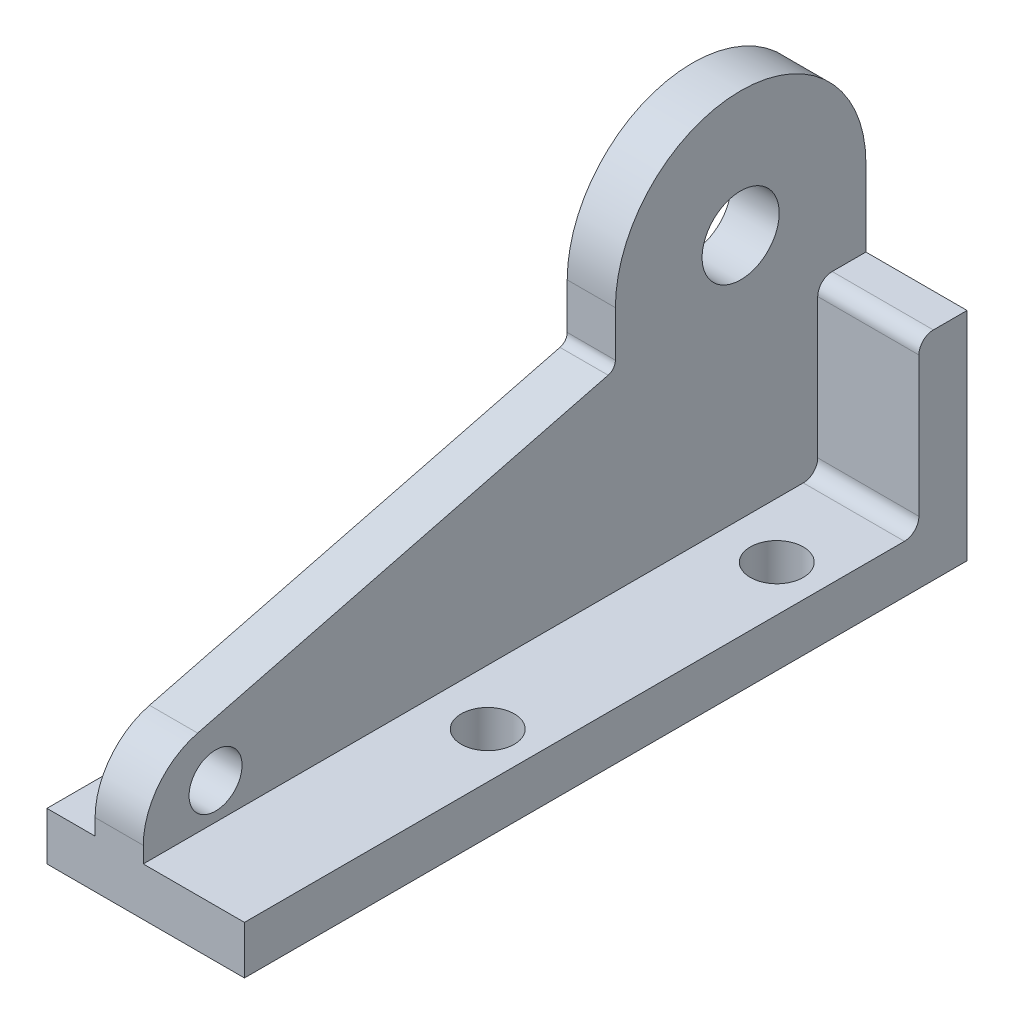
ISO-10303-21;
HEADER;
FILE_DESCRIPTION(('STEP AP214'),'2;1');
FILE_NAME('part.step','',(''),(''),'','','');
FILE_SCHEMA(('AUTOMOTIVE_DESIGN { 1 0 10303 214 1 1 1 1 }'));
ENDSEC;
DATA;
#1=APPLICATION_CONTEXT('core data for automotive mechanical design processes');
#2=APPLICATION_PROTOCOL_DEFINITION('international standard','automotive_design',2000,#1);
#3=PRODUCT_CONTEXT('',#1,'mechanical');
#4=PRODUCT('Part','Part','',(#3));
#5=PRODUCT_RELATED_PRODUCT_CATEGORY('part','',(#4));
#6=PRODUCT_DEFINITION_FORMATION('','',#4);
#7=PRODUCT_DEFINITION_CONTEXT('part definition',#1,'design');
#8=PRODUCT_DEFINITION('design','',#6,#7);
#9=PRODUCT_DEFINITION_SHAPE('','',#8);
#10=(LENGTH_UNIT() NAMED_UNIT(*) SI_UNIT(.MILLI.,.METRE.));
#11=(NAMED_UNIT(*) PLANE_ANGLE_UNIT() SI_UNIT($,.RADIAN.));
#12=(NAMED_UNIT(*) SI_UNIT($,.STERADIAN.) SOLID_ANGLE_UNIT());
#13=UNCERTAINTY_MEASURE_WITH_UNIT(LENGTH_MEASURE(1.E-05),#10,'distance_accuracy_value','');
#14=(GEOMETRIC_REPRESENTATION_CONTEXT(3) GLOBAL_UNCERTAINTY_ASSIGNED_CONTEXT((#13)) GLOBAL_UNIT_ASSIGNED_CONTEXT((#10,
#11,#12)) REPRESENTATION_CONTEXT('',''));
#15=CARTESIAN_POINT('',(0.,0.,0.));
#16=DIRECTION('',(0.,0.,1.));
#17=DIRECTION('',(1.,0.,0.));
#18=AXIS2_PLACEMENT_3D('',#15,#16,#17);
#19=CARTESIAN_POINT('',(0.,0.,0.));
#20=DIRECTION('',(1.,0.,0.));
#21=DIRECTION('',(0.,0.,-1.));
#22=AXIS2_PLACEMENT_3D('',#19,#20,#21);
#23=PLANE('',#22);
#24=DIRECTION('',(0.,0.,1.));
#25=VECTOR('',#24,1.);
#26=CARTESIAN_POINT('',(0.,0.,0.));
#27=LINE('',#26,#25);
#28=CARTESIAN_POINT('',(0.,0.,-75.));
#29=VERTEX_POINT('',#28);
#30=CARTESIAN_POINT('',(0.,0.,75.));
#31=VERTEX_POINT('',#30);
#32=EDGE_CURVE('E43',#29,#31,#27,.T.);
#33=ORIENTED_EDGE('',*,*,#32,.T.);
#34=DIRECTION('',(0.,-1.,0.));
#35=VECTOR('',#34,1.);
#36=CARTESIAN_POINT('',(0.,10.,75.));
#37=LINE('',#36,#35);
#38=CARTESIAN_POINT('',(0.,10.,75.));
#39=VERTEX_POINT('',#38);
#40=EDGE_CURVE('E297',#39,#31,#37,.T.);
#41=ORIENTED_EDGE('',*,*,#40,.F.);
#42=DIRECTION('',(0.,0.,1.));
#43=VECTOR('',#42,1.);
#44=CARTESIAN_POINT('',(0.,10.,0.));
#45=LINE('',#44,#43);
#46=CARTESIAN_POINT('',(0.,10.,-62.));
#47=VERTEX_POINT('',#46);
#48=EDGE_CURVE('E300',#47,#39,#45,.T.);
#49=ORIENTED_EDGE('',*,*,#48,.F.);
#50=CARTESIAN_POINT('',(0.,13.,-62.));
#51=DIRECTION('',(1.,0.,0.));
#52=DIRECTION('',(0.,0.,-1.));
#53=AXIS2_PLACEMENT_3D('',#50,#51,#52);
#54=CIRCLE('',#53,3.);
#55=CARTESIAN_POINT('',(0.,13.,-65.));
#56=VERTEX_POINT('',#55);
#57=EDGE_CURVE('E295',#56,#47,#54,.F.);
#58=ORIENTED_EDGE('',*,*,#57,.F.);
#59=DIRECTION('',(0.,1.,0.));
#60=VECTOR('',#59,1.);
#61=CARTESIAN_POINT('',(0.,0.,-65.));
#62=LINE('',#61,#60);
#63=CARTESIAN_POINT('',(0.,42.,-65.));
#64=VERTEX_POINT('',#63);
#65=EDGE_CURVE('E298',#56,#64,#62,.T.);
#66=ORIENTED_EDGE('',*,*,#65,.T.);
#67=CARTESIAN_POINT('',(0.,42.,-68.));
#68=DIRECTION('',(1.,0.,0.));
#69=DIRECTION('',(0.,0.,-1.));
#70=AXIS2_PLACEMENT_3D('',#67,#68,#69);
#71=CIRCLE('',#70,3.);
#72=CARTESIAN_POINT('',(0.,45.,-68.));
#73=VERTEX_POINT('',#72);
#74=EDGE_CURVE('E11',#64,#73,#71,.F.);
#75=ORIENTED_EDGE('',*,*,#74,.T.);
#76=DIRECTION('',(0.,0.,-1.));
#77=VECTOR('',#76,1.);
#78=CARTESIAN_POINT('',(0.,45.,-75.));
#79=LINE('',#78,#77);
#80=CARTESIAN_POINT('',(0.,45.,-75.));
#81=VERTEX_POINT('',#80);
#82=EDGE_CURVE('E48',#73,#81,#79,.T.);
#83=ORIENTED_EDGE('',*,*,#82,.T.);
#84=DIRECTION('',(0.,1.,0.));
#85=VECTOR('',#84,1.);
#86=CARTESIAN_POINT('',(0.,10.,-75.));
#87=LINE('',#86,#85);
#88=EDGE_CURVE('E301',#29,#81,#87,.T.);
#89=ORIENTED_EDGE('',*,*,#88,.F.);
#90=EDGE_LOOP('',(#33,#41,#49,#58,#66,#75,#83,#89));
#91=FACE_BOUND('',#90,.T.);
#92=ADVANCED_FACE('F40',(#91),#23,.F.);
#93=CARTESIAN_POINT('',(0.,13.,-62.));
#94=DIRECTION('',(-1.,0.,0.));
#95=DIRECTION('',(0.,0.,1.));
#96=AXIS2_PLACEMENT_3D('',#93,#94,#95);
#97=CYLINDRICAL_SURFACE('',#96,3.);
#98=CARTESIAN_POINT('',(41.,13.,-62.));
#99=DIRECTION('',(-1.,0.,0.));
#100=DIRECTION('',(0.,0.,1.));
#101=AXIS2_PLACEMENT_3D('',#98,#99,#100);
#102=CIRCLE('',#101,3.);
#103=CARTESIAN_POINT('',(41.,13.,-65.));
#104=VERTEX_POINT('',#103);
#105=CARTESIAN_POINT('',(41.,10.,-62.));
#106=VERTEX_POINT('',#105);
#107=EDGE_CURVE('E284',#104,#106,#102,.T.);
#108=ORIENTED_EDGE('',*,*,#107,.F.);
#109=DIRECTION('',(-1.,0.,0.));
#110=VECTOR('',#109,1.);
#111=CARTESIAN_POINT('',(-41.,13.,-65.));
#112=LINE('',#111,#110);
#113=CARTESIAN_POINT('',(20.,13.,-65.));
#114=VERTEX_POINT('',#113);
#115=EDGE_CURVE('E282',#114,#104,#112,.F.);
#116=ORIENTED_EDGE('',*,*,#115,.F.);
#117=CARTESIAN_POINT('',(20.,13.,-62.));
#118=DIRECTION('',(1.,0.,0.));
#119=DIRECTION('',(0.,0.,-1.));
#120=AXIS2_PLACEMENT_3D('',#117,#118,#119);
#121=CIRCLE('',#120,3.);
#122=CARTESIAN_POINT('',(20.,10.,-62.));
#123=VERTEX_POINT('',#122);
#124=EDGE_CURVE('E280',#123,#114,#121,.T.);
#125=ORIENTED_EDGE('',*,*,#124,.F.);
#126=DIRECTION('',(-1.,0.,0.));
#127=VECTOR('',#126,1.);
#128=CARTESIAN_POINT('',(0.,10.,-62.));
#129=LINE('',#128,#127);
#130=EDGE_CURVE('E185',#106,#123,#129,.T.);
#131=ORIENTED_EDGE('',*,*,#130,.F.);
#132=EDGE_LOOP('',(#108,#116,#125,#131));
#133=FACE_BOUND('',#132,.T.);
#134=ADVANCED_FACE('F382',(#133),#97,.F.);
#135=CARTESIAN_POINT('',(-41.,0.,-65.));
#136=DIRECTION('',(0.,0.,1.));
#137=DIRECTION('',(1.,0.,0.));
#138=AXIS2_PLACEMENT_3D('',#135,#136,#137);
#139=PLANE('',#138);
#140=DIRECTION('',(0.,1.,0.));
#141=VECTOR('',#140,1.);
#142=CARTESIAN_POINT('',(20.,0.,-65.));
#143=LINE('',#142,#141);
#144=CARTESIAN_POINT('',(20.,42.,-65.));
#145=VERTEX_POINT('',#144);
#146=EDGE_CURVE('E322',#114,#145,#143,.T.);
#147=ORIENTED_EDGE('',*,*,#146,.F.);
#148=ORIENTED_EDGE('',*,*,#115,.T.);
#149=DIRECTION('',(0.,-1.,0.));
#150=VECTOR('',#149,1.);
#151=CARTESIAN_POINT('',(41.,0.,-65.));
#152=LINE('',#151,#150);
#153=CARTESIAN_POINT('',(41.,42.,-65.));
#154=VERTEX_POINT('',#153);
#155=EDGE_CURVE('E315',#154,#104,#152,.T.);
#156=ORIENTED_EDGE('',*,*,#155,.F.);
#157=DIRECTION('',(1.,0.,0.));
#158=VECTOR('',#157,1.);
#159=CARTESIAN_POINT('',(-41.,42.,-65.));
#160=LINE('',#159,#158);
#161=EDGE_CURVE('E260',#154,#145,#160,.F.);
#162=ORIENTED_EDGE('',*,*,#161,.T.);
#163=EDGE_LOOP('',(#147,#148,#156,#162));
#164=FACE_BOUND('',#163,.T.);
#165=ADVANCED_FACE('F389',(#164),#139,.T.);
#166=CARTESIAN_POINT('',(-41.,42.,-68.));
#167=DIRECTION('',(1.,0.,0.));
#168=DIRECTION('',(0.,0.,-1.));
#169=AXIS2_PLACEMENT_3D('',#166,#167,#168);
#170=CYLINDRICAL_SURFACE('',#169,3.);
#171=CARTESIAN_POINT('',(20.,42.,-68.));
#172=DIRECTION('',(1.,0.,0.));
#173=DIRECTION('',(0.,0.,-1.));
#174=AXIS2_PLACEMENT_3D('',#171,#172,#173);
#175=CIRCLE('',#174,3.);
#176=CARTESIAN_POINT('',(20.,45.,-68.));
#177=VERTEX_POINT('',#176);
#178=EDGE_CURVE('E263',#145,#177,#175,.F.);
#179=ORIENTED_EDGE('',*,*,#178,.F.);
#180=ORIENTED_EDGE('',*,*,#161,.F.);
#181=CARTESIAN_POINT('',(41.,42.,-68.));
#182=DIRECTION('',(-1.,0.,0.));
#183=DIRECTION('',(0.,0.,1.));
#184=AXIS2_PLACEMENT_3D('',#181,#182,#183);
#185=CIRCLE('',#184,3.);
#186=CARTESIAN_POINT('',(41.,45.,-68.));
#187=VERTEX_POINT('',#186);
#188=EDGE_CURVE('E258',#187,#154,#185,.F.);
#189=ORIENTED_EDGE('',*,*,#188,.F.);
#190=DIRECTION('',(1.,0.,0.));
#191=VECTOR('',#190,1.);
#192=CARTESIAN_POINT('',(-41.,45.,-68.));
#193=LINE('',#192,#191);
#194=EDGE_CURVE('E248',#177,#187,#193,.T.);
#195=ORIENTED_EDGE('',*,*,#194,.F.);
#196=EDGE_LOOP('',(#179,#180,#189,#195));
#197=FACE_BOUND('',#196,.T.);
#198=ADVANCED_FACE('F423',(#197),#170,.T.);
#199=CARTESIAN_POINT('',(0.,0.,-23.));
#200=DIRECTION('',(0.,0.,-1.));
#201=DIRECTION('',(-1.,0.,0.));
#202=AXIS2_PLACEMENT_3D('',#199,#200,#201);
#203=PLANE('',#202);
#204=DIRECTION('',(0.,-1.,0.));
#205=VECTOR('',#204,1.);
#206=CARTESIAN_POINT('',(10.,45.,-23.));
#207=LINE('',#206,#205);
#208=CARTESIAN_POINT('',(10.,61.,-23.));
#209=VERTEX_POINT('',#208);
#210=CARTESIAN_POINT('',(10.,51.5538473239565,-23.));
#211=VERTEX_POINT('',#210);
#212=EDGE_CURVE('E335',#209,#211,#207,.T.);
#213=ORIENTED_EDGE('',*,*,#212,.T.);
#214=DIRECTION('',(1.,0.,0.));
#215=VECTOR('',#214,1.);
#216=CARTESIAN_POINT('',(0.,51.5538473239565,-23.));
#217=LINE('',#216,#215);
#218=CARTESIAN_POINT('',(20.,51.5538473239565,-23.));
#219=VERTEX_POINT('',#218);
#220=EDGE_CURVE('E286',#211,#219,#217,.T.);
#221=ORIENTED_EDGE('',*,*,#220,.T.);
#222=DIRECTION('',(0.,1.,0.));
#223=VECTOR('',#222,1.);
#224=CARTESIAN_POINT('',(20.,45.,-23.));
#225=LINE('',#224,#223);
#226=CARTESIAN_POINT('',(20.,61.,-23.));
#227=VERTEX_POINT('',#226);
#228=EDGE_CURVE('E333',#219,#227,#225,.T.);
#229=ORIENTED_EDGE('',*,*,#228,.T.);
#230=DIRECTION('',(1.,0.,0.));
#231=VECTOR('',#230,1.);
#232=CARTESIAN_POINT('',(20.,61.,-23.));
#233=LINE('',#232,#231);
#234=EDGE_CURVE('E228',#227,#209,#233,.F.);
#235=ORIENTED_EDGE('',*,*,#234,.T.);
#236=EDGE_LOOP('',(#213,#221,#229,#235));
#237=FACE_BOUND('',#236,.T.);
#238=ADVANCED_FACE('F425',(#237),#203,.F.);
#239=CARTESIAN_POINT('',(0.,51.5538473239565,-21.));
#240=DIRECTION('',(1.,0.,0.));
#241=DIRECTION('',(0.,0.,-1.));
#242=AXIS2_PLACEMENT_3D('',#239,#240,#241);
#243=CYLINDRICAL_SURFACE('',#242,2.);
#244=CARTESIAN_POINT('',(10.,51.5538473239565,-21.));
#245=DIRECTION('',(-1.,0.,0.));
#246=DIRECTION('',(0.,-1.,0.));
#247=AXIS2_PLACEMENT_3D('',#244,#245,#246);
#248=CIRCLE('',#247,2.);
#249=CARTESIAN_POINT('',(10.,49.6159110937015,-21.4943714873099));
#250=VERTEX_POINT('',#249);
#251=EDGE_CURVE('E293',#250,#211,#248,.F.);
#252=ORIENTED_EDGE('',*,*,#251,.F.);
#253=DIRECTION('',(1.,0.,0.));
#254=VECTOR('',#253,1.);
#255=CARTESIAN_POINT('',(-95.8489489791939,49.6159110937015,-21.4943714873099));
#256=LINE('',#255,#254);
#257=CARTESIAN_POINT('',(20.,49.6159110937015,-21.4943714873099));
#258=VERTEX_POINT('',#257);
#259=EDGE_CURVE('E289',#258,#250,#256,.F.);
#260=ORIENTED_EDGE('',*,*,#259,.F.);
#261=CARTESIAN_POINT('',(20.,51.5538473239565,-21.));
#262=DIRECTION('',(1.,0.,0.));
#263=DIRECTION('',(0.,0.,-1.));
#264=AXIS2_PLACEMENT_3D('',#261,#262,#263);
#265=CIRCLE('',#264,2.);
#266=EDGE_CURVE('E291',#219,#258,#265,.F.);
#267=ORIENTED_EDGE('',*,*,#266,.F.);
#268=ORIENTED_EDGE('',*,*,#220,.F.);
#269=EDGE_LOOP('',(#252,#260,#267,#268));
#270=FACE_BOUND('',#269,.T.);
#271=ADVANCED_FACE('F431',(#270),#243,.F.);
#272=CARTESIAN_POINT('',(-95.8489489791939,50.,-23.));
#273=DIRECTION('',(0.,0.968968115127499,0.247185743654974));
#274=DIRECTION('',(0.,-0.247185743654974,0.968968115127499));
#275=AXIS2_PLACEMENT_3D('',#272,#273,#274);
#276=PLANE('',#275);
#277=DIRECTION('',(0.,-0.247185743654974,0.968968115127499));
#278=VECTOR('',#277,1.);
#279=CARTESIAN_POINT('',(20.,50.,-23.));
#280=LINE('',#279,#278);
#281=CARTESIAN_POINT('',(20.,27.8806667972386,63.7077861548246));
#282=VERTEX_POINT('',#281);
#283=EDGE_CURVE('E198',#258,#282,#280,.T.);
#284=ORIENTED_EDGE('',*,*,#283,.F.);
#285=ORIENTED_EDGE('',*,*,#259,.T.);
#286=DIRECTION('',(0.,-0.247185743654974,0.968968115127499));
#287=VECTOR('',#286,1.);
#288=CARTESIAN_POINT('',(10.,50.,-23.));
#289=LINE('',#288,#287);
#290=CARTESIAN_POINT('',(10.,27.8806667972386,63.7077861548246));
#291=VERTEX_POINT('',#290);
#292=EDGE_CURVE('E197',#250,#291,#289,.T.);
#293=ORIENTED_EDGE('',*,*,#292,.T.);
#294=DIRECTION('',(1.,0.,0.));
#295=VECTOR('',#294,1.);
#296=CARTESIAN_POINT('',(20.,27.8806667972386,63.7077861548246));
#297=LINE('',#296,#295);
#298=EDGE_CURVE('E239',#291,#282,#297,.T.);
#299=ORIENTED_EDGE('',*,*,#298,.T.);
#300=EDGE_LOOP('',(#284,#285,#293,#299));
#301=FACE_BOUND('',#300,.T.);
#302=ADVANCED_FACE('F433',(#301),#276,.T.);
#303=CARTESIAN_POINT('',(-41.,17.5,60.));
#304=DIRECTION('',(1.,0.,0.));
#305=DIRECTION('',(0.,0.,-1.));
#306=AXIS2_PLACEMENT_3D('',#303,#304,#305);
#307=CYLINDRICAL_SURFACE('',#306,5.5);
#308=CARTESIAN_POINT('',(10.,17.5,60.));
#309=DIRECTION('',(-1.,0.,0.));
#310=DIRECTION('',(0.,-1.,0.));
#311=AXIS2_PLACEMENT_3D('',#308,#309,#310);
#312=CIRCLE('',#311,5.5);
#313=CARTESIAN_POINT('',(10.,12.,60.));
#314=VERTEX_POINT('',#313);
#315=EDGE_CURVE('E249',#314,#314,#312,.T.);
#316=ORIENTED_EDGE('',*,*,#315,.T.);
#317=EDGE_LOOP('',(#316));
#318=FACE_BOUND('',#317,.T.);
#319=CARTESIAN_POINT('',(20.,17.5,60.));
#320=DIRECTION('',(1.,0.,0.));
#321=DIRECTION('',(0.,0.,-1.));
#322=AXIS2_PLACEMENT_3D('',#319,#320,#321);
#323=CIRCLE('',#322,5.5);
#324=CARTESIAN_POINT('',(20.,17.5,54.5));
#325=VERTEX_POINT('',#324);
#326=EDGE_CURVE('E343',#325,#325,#323,.T.);
#327=ORIENTED_EDGE('',*,*,#326,.T.);
#328=EDGE_LOOP('',(#327));
#329=FACE_BOUND('',#328,.T.);
#330=ADVANCED_FACE('F440',(#318,#329),#307,.F.);
#331=CARTESIAN_POINT('',(-41.,61.,-49.));
#332=DIRECTION('',(1.,0.,0.));
#333=DIRECTION('',(0.,0.,-1.));
#334=AXIS2_PLACEMENT_3D('',#331,#332,#333);
#335=CYLINDRICAL_SURFACE('',#334,8.);
#336=CARTESIAN_POINT('',(10.,61.,-49.));
#337=DIRECTION('',(-1.,0.,0.));
#338=DIRECTION('',(0.,-1.,0.));
#339=AXIS2_PLACEMENT_3D('',#336,#337,#338);
#340=CIRCLE('',#339,8.);
#341=CARTESIAN_POINT('',(10.,53.,-49.));
#342=VERTEX_POINT('',#341);
#343=EDGE_CURVE('E252',#342,#342,#340,.T.);
#344=ORIENTED_EDGE('',*,*,#343,.T.);
#345=EDGE_LOOP('',(#344));
#346=FACE_BOUND('',#345,.T.);
#347=CARTESIAN_POINT('',(20.,61.,-49.));
#348=DIRECTION('',(1.,0.,0.));
#349=DIRECTION('',(0.,0.,-1.));
#350=AXIS2_PLACEMENT_3D('',#347,#348,#349);
#351=CIRCLE('',#350,8.);
#352=CARTESIAN_POINT('',(20.,61.,-57.));
#353=VERTEX_POINT('',#352);
#354=EDGE_CURVE('E253',#353,#353,#351,.T.);
#355=ORIENTED_EDGE('',*,*,#354,.T.);
#356=EDGE_LOOP('',(#355));
#357=FACE_BOUND('',#356,.T.);
#358=ADVANCED_FACE('F639',(#346,#357),#335,.F.);
#359=CARTESIAN_POINT('',(-41.,45.,-75.));
#360=DIRECTION('',(0.,1.,0.));
#361=DIRECTION('',(0.,0.,1.));
#362=AXIS2_PLACEMENT_3D('',#359,#360,#361);
#363=PLANE('',#362);
#364=DIRECTION('',(0.,0.,-1.));
#365=VECTOR('',#364,1.);
#366=CARTESIAN_POINT('',(20.,45.,-75.));
#367=LINE('',#366,#365);
#368=CARTESIAN_POINT('',(20.,45.,-75.));
#369=VERTEX_POINT('',#368);
#370=EDGE_CURVE('E226',#177,#369,#367,.T.);
#371=ORIENTED_EDGE('',*,*,#370,.F.);
#372=ORIENTED_EDGE('',*,*,#194,.T.);
#373=DIRECTION('',(0.,0.,1.));
#374=VECTOR('',#373,1.);
#375=CARTESIAN_POINT('',(41.,45.,-75.));
#376=LINE('',#375,#374);
#377=CARTESIAN_POINT('',(41.,45.,-75.));
#378=VERTEX_POINT('',#377);
#379=EDGE_CURVE('E319',#378,#187,#376,.T.);
#380=ORIENTED_EDGE('',*,*,#379,.F.);
#381=DIRECTION('',(1.,0.,0.));
#382=VECTOR('',#381,1.);
#383=CARTESIAN_POINT('',(-41.,45.,-75.));
#384=LINE('',#383,#382);
#385=EDGE_CURVE('E314',#369,#378,#384,.T.);
#386=ORIENTED_EDGE('',*,*,#385,.F.);
#387=EDGE_LOOP('',(#371,#372,#380,#386));
#388=FACE_BOUND('',#387,.T.);
#389=ADVANCED_FACE('F418',(#388),#363,.T.);
#390=CARTESIAN_POINT('',(20.,61.,-49.));
#391=DIRECTION('',(-1.,0.,0.));
#392=DIRECTION('',(0.,0.,1.));
#393=AXIS2_PLACEMENT_3D('',#390,#391,#392);
#394=CYLINDRICAL_SURFACE('',#393,26.);
#395=ORIENTED_EDGE('',*,*,#234,.F.);
#396=CARTESIAN_POINT('',(20.,61.,-49.));
#397=DIRECTION('',(1.,0.,0.));
#398=DIRECTION('',(0.,0.,-1.));
#399=AXIS2_PLACEMENT_3D('',#396,#397,#398);
#400=CIRCLE('',#399,26.);
#401=CARTESIAN_POINT('',(20.,61.,-75.));
#402=VERTEX_POINT('',#401);
#403=EDGE_CURVE('E234',#402,#227,#400,.T.);
#404=ORIENTED_EDGE('',*,*,#403,.F.);
#405=DIRECTION('',(1.,0.,0.));
#406=VECTOR('',#405,1.);
#407=CARTESIAN_POINT('',(20.,61.,-75.));
#408=LINE('',#407,#406);
#409=CARTESIAN_POINT('',(10.,61.,-75.));
#410=VERTEX_POINT('',#409);
#411=EDGE_CURVE('E231',#410,#402,#408,.T.);
#412=ORIENTED_EDGE('',*,*,#411,.F.);
#413=CARTESIAN_POINT('',(10.,61.,-49.));
#414=DIRECTION('',(-1.,0.,0.));
#415=DIRECTION('',(0.,-1.,0.));
#416=AXIS2_PLACEMENT_3D('',#413,#414,#415);
#417=CIRCLE('',#416,26.);
#418=EDGE_CURVE('E237',#209,#410,#417,.T.);
#419=ORIENTED_EDGE('',*,*,#418,.F.);
#420=EDGE_LOOP('',(#395,#404,#412,#419));
#421=FACE_BOUND('',#420,.T.);
#422=ADVANCED_FACE('F412',(#421),#394,.T.);
#423=CARTESIAN_POINT('',(-95.8489489791939,13.3461450703261,60.));
#424=DIRECTION('',(-1.,0.,0.));
#425=DIRECTION('',(0.,0.,1.));
#426=AXIS2_PLACEMENT_3D('',#423,#424,#425);
#427=CYLINDRICAL_SURFACE('',#426,15.);
#428=CARTESIAN_POINT('',(10.,13.3461450703261,60.));
#429=DIRECTION('',(-1.,0.,0.));
#430=DIRECTION('',(0.,-1.,0.));
#431=AXIS2_PLACEMENT_3D('',#428,#429,#430);
#432=CIRCLE('',#431,15.);
#433=CARTESIAN_POINT('',(10.,13.3461450703261,75.));
#434=VERTEX_POINT('',#433);
#435=EDGE_CURVE('E245',#434,#291,#432,.T.);
#436=ORIENTED_EDGE('',*,*,#435,.F.);
#437=DIRECTION('',(1.,0.,0.));
#438=VECTOR('',#437,1.);
#439=CARTESIAN_POINT('',(10.,13.3461450703261,75.));
#440=LINE('',#439,#438);
#441=CARTESIAN_POINT('',(20.,13.3461450703262,75.));
#442=VERTEX_POINT('',#441);
#443=EDGE_CURVE('E243',#442,#434,#440,.F.);
#444=ORIENTED_EDGE('',*,*,#443,.F.);
#445=CARTESIAN_POINT('',(20.,13.3461450703261,60.));
#446=DIRECTION('',(1.,0.,0.));
#447=DIRECTION('',(0.,0.,-1.));
#448=AXIS2_PLACEMENT_3D('',#445,#446,#447);
#449=CIRCLE('',#448,15.);
#450=EDGE_CURVE('E194',#282,#442,#449,.T.);
#451=ORIENTED_EDGE('',*,*,#450,.F.);
#452=ORIENTED_EDGE('',*,*,#298,.F.);
#453=EDGE_LOOP('',(#436,#444,#451,#452));
#454=FACE_BOUND('',#453,.T.);
#455=ADVANCED_FACE('F417',(#454),#427,.T.);
#456=CARTESIAN_POINT('',(20.,45.,-75.));
#457=DIRECTION('',(1.,0.,0.));
#458=DIRECTION('',(0.,0.,-1.));
#459=AXIS2_PLACEMENT_3D('',#456,#457,#458);
#460=PLANE('',#459);
#461=ORIENTED_EDGE('',*,*,#354,.F.);
#462=EDGE_LOOP('',(#461));
#463=FACE_BOUND('',#462,.T.);
#464=ORIENTED_EDGE('',*,*,#326,.F.);
#465=EDGE_LOOP('',(#464));
#466=FACE_BOUND('',#465,.T.);
#467=DIRECTION('',(0.,0.,1.));
#468=VECTOR('',#467,1.);
#469=CARTESIAN_POINT('',(20.,10.,-75.));
#470=LINE('',#469,#468);
#471=CARTESIAN_POINT('',(20.,10.,75.));
#472=VERTEX_POINT('',#471);
#473=EDGE_CURVE('E177',#123,#472,#470,.T.);
#474=ORIENTED_EDGE('',*,*,#473,.F.);
#475=ORIENTED_EDGE('',*,*,#124,.T.);
#476=ORIENTED_EDGE('',*,*,#146,.T.);
#477=ORIENTED_EDGE('',*,*,#178,.T.);
#478=ORIENTED_EDGE('',*,*,#370,.T.);
#479=DIRECTION('',(0.,1.,0.));
#480=VECTOR('',#479,1.);
#481=CARTESIAN_POINT('',(20.,45.,-75.));
#482=LINE('',#481,#480);
#483=EDGE_CURVE('E327',#369,#402,#482,.T.);
#484=ORIENTED_EDGE('',*,*,#483,.T.);
#485=ORIENTED_EDGE('',*,*,#403,.T.);
#486=ORIENTED_EDGE('',*,*,#228,.F.);
#487=ORIENTED_EDGE('',*,*,#266,.T.);
#488=ORIENTED_EDGE('',*,*,#283,.T.);
#489=ORIENTED_EDGE('',*,*,#450,.T.);
#490=DIRECTION('',(0.,-1.,0.));
#491=VECTOR('',#490,1.);
#492=CARTESIAN_POINT('',(20.,25.,75.));
#493=LINE('',#492,#491);
#494=EDGE_CURVE('E191',#442,#472,#493,.T.);
#495=ORIENTED_EDGE('',*,*,#494,.T.);
#496=EDGE_LOOP('',(#474,#475,#476,#477,#478,#484,#485,#486,#487,#488,#489,#495));
#497=FACE_BOUND('',#496,.T.);
#498=ADVANCED_FACE('F192',(#463,#466,#497),#460,.T.);
#499=CARTESIAN_POINT('',(0.,10.,0.));
#500=DIRECTION('',(0.,-1.,0.));
#501=DIRECTION('',(0.,0.,-1.));
#502=AXIS2_PLACEMENT_3D('',#499,#500,#501);
#503=PLANE('',#502);
#504=CARTESIAN_POINT('',(31.5,10.,15.));
#505=DIRECTION('',(0.,1.,0.));
#506=DIRECTION('',(0.,0.,1.));
#507=AXIS2_PLACEMENT_3D('',#504,#505,#506);
#508=CIRCLE('',#507,5.5);
#509=CARTESIAN_POINT('',(31.5,10.,20.5));
#510=VERTEX_POINT('',#509);
#511=EDGE_CURVE('E352',#510,#510,#508,.T.);
#512=ORIENTED_EDGE('',*,*,#511,.F.);
#513=EDGE_LOOP('',(#512));
#514=FACE_BOUND('',#513,.T.);
#515=CARTESIAN_POINT('',(31.5,10.,-45.));
#516=DIRECTION('',(0.,1.,0.));
#517=DIRECTION('',(0.,0.,1.));
#518=AXIS2_PLACEMENT_3D('',#515,#516,#517);
#519=CIRCLE('',#518,5.5);
#520=CARTESIAN_POINT('',(31.5,10.,-39.5));
#521=VERTEX_POINT('',#520);
#522=EDGE_CURVE('E349',#521,#521,#519,.T.);
#523=ORIENTED_EDGE('',*,*,#522,.F.);
#524=EDGE_LOOP('',(#523));
#525=FACE_BOUND('',#524,.T.);
#526=DIRECTION('',(0.,0.,-1.));
#527=VECTOR('',#526,1.);
#528=CARTESIAN_POINT('',(41.,10.,75.));
#529=LINE('',#528,#527);
#530=CARTESIAN_POINT('',(41.,10.,75.));
#531=VERTEX_POINT('',#530);
#532=EDGE_CURVE('E206',#531,#106,#529,.T.);
#533=ORIENTED_EDGE('',*,*,#532,.T.);
#534=ORIENTED_EDGE('',*,*,#130,.T.);
#535=ORIENTED_EDGE('',*,*,#473,.T.);
#536=DIRECTION('',(1.,0.,0.));
#537=VECTOR('',#536,1.);
#538=CARTESIAN_POINT('',(-41.,10.,75.));
#539=LINE('',#538,#537);
#540=EDGE_CURVE('E182',#472,#531,#539,.T.);
#541=ORIENTED_EDGE('',*,*,#540,.T.);
#542=EDGE_LOOP('',(#533,#534,#535,#541));
#543=FACE_BOUND('',#542,.T.);
#544=ADVANCED_FACE('F180',(#514,#525,#543),#503,.F.);
#545=CARTESIAN_POINT('',(31.5,0.,-45.));
#546=DIRECTION('',(0.,1.,0.));
#547=DIRECTION('',(0.,0.,1.));
#548=AXIS2_PLACEMENT_3D('',#545,#546,#547);
#549=CYLINDRICAL_SURFACE('',#548,5.5);
#550=CARTESIAN_POINT('',(31.5,0.,-45.));
#551=DIRECTION('',(0.,1.,0.));
#552=DIRECTION('',(0.,0.,1.));
#553=AXIS2_PLACEMENT_3D('',#550,#551,#552);
#554=CIRCLE('',#553,5.5);
#555=CARTESIAN_POINT('',(31.5,0.,-39.5));
#556=VERTEX_POINT('',#555);
#557=EDGE_CURVE('E346',#556,#556,#554,.T.);
#558=ORIENTED_EDGE('',*,*,#557,.F.);
#559=EDGE_LOOP('',(#558));
#560=FACE_BOUND('',#559,.T.);
#561=ORIENTED_EDGE('',*,*,#522,.T.);
#562=EDGE_LOOP('',(#561));
#563=FACE_BOUND('',#562,.T.);
#564=ADVANCED_FACE('F365',(#560,#563),#549,.F.);
#565=CARTESIAN_POINT('',(31.5,0.,15.));
#566=DIRECTION('',(0.,1.,0.));
#567=DIRECTION('',(0.,0.,1.));
#568=AXIS2_PLACEMENT_3D('',#565,#566,#567);
#569=CYLINDRICAL_SURFACE('',#568,5.5);
#570=CARTESIAN_POINT('',(31.5,0.,15.));
#571=DIRECTION('',(0.,1.,0.));
#572=DIRECTION('',(0.,0.,1.));
#573=AXIS2_PLACEMENT_3D('',#570,#571,#572);
#574=CIRCLE('',#573,5.5);
#575=CARTESIAN_POINT('',(31.5,0.,20.5));
#576=VERTEX_POINT('',#575);
#577=EDGE_CURVE('E355',#576,#576,#574,.T.);
#578=ORIENTED_EDGE('',*,*,#577,.F.);
#579=EDGE_LOOP('',(#578));
#580=FACE_BOUND('',#579,.T.);
#581=ORIENTED_EDGE('',*,*,#511,.T.);
#582=EDGE_LOOP('',(#581));
#583=FACE_BOUND('',#582,.T.);
#584=ADVANCED_FACE('F361',(#580,#583),#569,.F.);
#585=CARTESIAN_POINT('',(-41.,10.,75.));
#586=DIRECTION('',(0.,0.,-1.));
#587=DIRECTION('',(-1.,0.,0.));
#588=AXIS2_PLACEMENT_3D('',#585,#586,#587);
#589=PLANE('',#588);
#590=CARTESIAN_POINT('',(10.,10.,75.));
#591=VERTEX_POINT('',#590);
#592=EDGE_CURVE('E205',#39,#591,#539,.T.);
#593=ORIENTED_EDGE('',*,*,#592,.F.);
#594=ORIENTED_EDGE('',*,*,#40,.T.);
#595=DIRECTION('',(1.,0.,0.));
#596=VECTOR('',#595,1.);
#597=CARTESIAN_POINT('',(-41.,0.,75.));
#598=LINE('',#597,#596);
#599=CARTESIAN_POINT('',(41.,0.,75.));
#600=VERTEX_POINT('',#599);
#601=EDGE_CURVE('E208',#31,#600,#598,.T.);
#602=ORIENTED_EDGE('',*,*,#601,.T.);
#603=DIRECTION('',(0.,-1.,0.));
#604=VECTOR('',#603,1.);
#605=CARTESIAN_POINT('',(41.,10.,75.));
#606=LINE('',#605,#604);
#607=EDGE_CURVE('E203',#531,#600,#606,.T.);
#608=ORIENTED_EDGE('',*,*,#607,.F.);
#609=ORIENTED_EDGE('',*,*,#540,.F.);
#610=ORIENTED_EDGE('',*,*,#494,.F.);
#611=ORIENTED_EDGE('',*,*,#443,.T.);
#612=DIRECTION('',(0.,-1.,0.));
#613=VECTOR('',#612,1.);
#614=CARTESIAN_POINT('',(10.,25.,75.));
#615=LINE('',#614,#613);
#616=EDGE_CURVE('E338',#434,#591,#615,.T.);
#617=ORIENTED_EDGE('',*,*,#616,.T.);
#618=EDGE_LOOP('',(#593,#594,#602,#608,#609,#610,#611,#617));
#619=FACE_BOUND('',#618,.T.);
#620=ADVANCED_FACE('F201',(#619),#589,.F.);
#621=CARTESIAN_POINT('',(41.,10.,75.));
#622=DIRECTION('',(-1.,0.,0.));
#623=DIRECTION('',(0.,0.,1.));
#624=AXIS2_PLACEMENT_3D('',#621,#622,#623);
#625=PLANE('',#624);
#626=ORIENTED_EDGE('',*,*,#379,.T.);
#627=ORIENTED_EDGE('',*,*,#188,.T.);
#628=ORIENTED_EDGE('',*,*,#155,.T.);
#629=ORIENTED_EDGE('',*,*,#107,.T.);
#630=ORIENTED_EDGE('',*,*,#532,.F.);
#631=ORIENTED_EDGE('',*,*,#607,.T.);
#632=DIRECTION('',(0.,0.,-1.));
#633=VECTOR('',#632,1.);
#634=CARTESIAN_POINT('',(41.,0.,75.));
#635=LINE('',#634,#633);
#636=CARTESIAN_POINT('',(41.,0.,-75.));
#637=VERTEX_POINT('',#636);
#638=EDGE_CURVE('E212',#600,#637,#635,.T.);
#639=ORIENTED_EDGE('',*,*,#638,.T.);
#640=DIRECTION('',(0.,-1.,0.));
#641=VECTOR('',#640,1.);
#642=CARTESIAN_POINT('',(41.,10.,-75.));
#643=LINE('',#642,#641);
#644=EDGE_CURVE('E220',#378,#637,#643,.T.);
#645=ORIENTED_EDGE('',*,*,#644,.F.);
#646=EDGE_LOOP('',(#626,#627,#628,#629,#630,#631,#639,#645));
#647=FACE_BOUND('',#646,.T.);
#648=ADVANCED_FACE('F405',(#647),#625,.F.);
#649=CARTESIAN_POINT('',(-41.,10.,-75.));
#650=DIRECTION('',(0.,0.,1.));
#651=DIRECTION('',(1.,0.,0.));
#652=AXIS2_PLACEMENT_3D('',#649,#650,#651);
#653=PLANE('',#652);
#654=DIRECTION('',(-1.,0.,0.));
#655=VECTOR('',#654,1.);
#656=CARTESIAN_POINT('',(-41.,0.,-75.));
#657=LINE('',#656,#655);
#658=EDGE_CURVE('E214',#637,#29,#657,.T.);
#659=ORIENTED_EDGE('',*,*,#658,.T.);
#660=ORIENTED_EDGE('',*,*,#88,.T.);
#661=CARTESIAN_POINT('',(10.,45.,-75.));
#662=VERTEX_POINT('',#661);
#663=EDGE_CURVE('E215',#81,#662,#384,.T.);
#664=ORIENTED_EDGE('',*,*,#663,.T.);
#665=DIRECTION('',(0.,-1.,0.));
#666=VECTOR('',#665,1.);
#667=CARTESIAN_POINT('',(10.,45.,-75.));
#668=LINE('',#667,#666);
#669=EDGE_CURVE('E331',#410,#662,#668,.T.);
#670=ORIENTED_EDGE('',*,*,#669,.F.);
#671=ORIENTED_EDGE('',*,*,#411,.T.);
#672=ORIENTED_EDGE('',*,*,#483,.F.);
#673=ORIENTED_EDGE('',*,*,#385,.T.);
#674=ORIENTED_EDGE('',*,*,#644,.T.);
#675=EDGE_LOOP('',(#659,#660,#664,#670,#671,#672,#673,#674));
#676=FACE_BOUND('',#675,.T.);
#677=ADVANCED_FACE('F305',(#676),#653,.F.);
#678=ORIENTED_EDGE('',*,*,#82,.F.);
#679=DIRECTION('',(1.,0.,0.));
#680=VECTOR('',#679,1.);
#681=CARTESIAN_POINT('',(-41.,45.,-68.));
#682=LINE('',#681,#680);
#683=CARTESIAN_POINT('',(10.,45.,-68.));
#684=VERTEX_POINT('',#683);
#685=EDGE_CURVE('E265',#73,#684,#682,.T.);
#686=ORIENTED_EDGE('',*,*,#685,.T.);
#687=DIRECTION('',(0.,0.,1.));
#688=VECTOR('',#687,1.);
#689=CARTESIAN_POINT('',(10.,45.,-75.));
#690=LINE('',#689,#688);
#691=EDGE_CURVE('E223',#662,#684,#690,.T.);
#692=ORIENTED_EDGE('',*,*,#691,.F.);
#693=ORIENTED_EDGE('',*,*,#663,.F.);
#694=EDGE_LOOP('',(#678,#686,#692,#693));
#695=FACE_BOUND('',#694,.T.);
#696=ADVANCED_FACE('F313',(#695),#363,.T.);
#697=CARTESIAN_POINT('',(10.,45.,-75.));
#698=DIRECTION('',(-1.,0.,0.));
#699=DIRECTION('',(0.,-1.,0.));
#700=AXIS2_PLACEMENT_3D('',#697,#698,#699);
#701=PLANE('',#700);
#702=ORIENTED_EDGE('',*,*,#343,.F.);
#703=EDGE_LOOP('',(#702));
#704=FACE_BOUND('',#703,.T.);
#705=ORIENTED_EDGE('',*,*,#315,.F.);
#706=EDGE_LOOP('',(#705));
#707=FACE_BOUND('',#706,.T.);
#708=DIRECTION('',(0.,-1.,0.));
#709=VECTOR('',#708,1.);
#710=CARTESIAN_POINT('',(10.,0.,-65.));
#711=LINE('',#710,#709);
#712=CARTESIAN_POINT('',(10.,42.,-65.));
#713=VERTEX_POINT('',#712);
#714=CARTESIAN_POINT('',(10.,13.,-65.));
#715=VERTEX_POINT('',#714);
#716=EDGE_CURVE('E187',#713,#715,#711,.T.);
#717=ORIENTED_EDGE('',*,*,#716,.T.);
#718=CARTESIAN_POINT('',(10.,13.,-62.));
#719=DIRECTION('',(-1.,0.,0.));
#720=DIRECTION('',(0.,-1.,0.));
#721=AXIS2_PLACEMENT_3D('',#718,#719,#720);
#722=CIRCLE('',#721,3.);
#723=CARTESIAN_POINT('',(10.,10.,-62.));
#724=VERTEX_POINT('',#723);
#725=EDGE_CURVE('E277',#715,#724,#722,.T.);
#726=ORIENTED_EDGE('',*,*,#725,.T.);
#727=DIRECTION('',(0.,0.,1.));
#728=VECTOR('',#727,1.);
#729=CARTESIAN_POINT('',(10.,10.,-75.));
#730=LINE('',#729,#728);
#731=EDGE_CURVE('E188',#724,#591,#730,.T.);
#732=ORIENTED_EDGE('',*,*,#731,.T.);
#733=ORIENTED_EDGE('',*,*,#616,.F.);
#734=ORIENTED_EDGE('',*,*,#435,.T.);
#735=ORIENTED_EDGE('',*,*,#292,.F.);
#736=ORIENTED_EDGE('',*,*,#251,.T.);
#737=ORIENTED_EDGE('',*,*,#212,.F.);
#738=ORIENTED_EDGE('',*,*,#418,.T.);
#739=ORIENTED_EDGE('',*,*,#669,.T.);
#740=ORIENTED_EDGE('',*,*,#691,.T.);
#741=CARTESIAN_POINT('',(10.,42.,-68.));
#742=DIRECTION('',(-1.,0.,0.));
#743=DIRECTION('',(0.,-1.,0.));
#744=AXIS2_PLACEMENT_3D('',#741,#742,#743);
#745=CIRCLE('',#744,3.);
#746=EDGE_CURVE('E270',#684,#713,#745,.F.);
#747=ORIENTED_EDGE('',*,*,#746,.T.);
#748=EDGE_LOOP('',(#717,#726,#732,#733,#734,#735,#736,#737,#738,#739,#740,#747));
#749=FACE_BOUND('',#748,.T.);
#750=ADVANCED_FACE('F451',(#704,#707,#749),#701,.T.);
#751=DIRECTION('',(-1.,0.,0.));
#752=VECTOR('',#751,1.);
#753=CARTESIAN_POINT('',(0.,10.,-62.));
#754=LINE('',#753,#752);
#755=EDGE_CURVE('E272',#724,#47,#754,.T.);
#756=ORIENTED_EDGE('',*,*,#755,.T.);
#757=ORIENTED_EDGE('',*,*,#48,.T.);
#758=ORIENTED_EDGE('',*,*,#592,.T.);
#759=ORIENTED_EDGE('',*,*,#731,.F.);
#760=EDGE_LOOP('',(#756,#757,#758,#759));
#761=FACE_BOUND('',#760,.T.);
#762=ADVANCED_FACE('F367',(#761),#503,.F.);
#763=ORIENTED_EDGE('',*,*,#65,.F.);
#764=DIRECTION('',(-1.,0.,0.));
#765=VECTOR('',#764,1.);
#766=CARTESIAN_POINT('',(-41.,13.,-65.));
#767=LINE('',#766,#765);
#768=EDGE_CURVE('E275',#56,#715,#767,.F.);
#769=ORIENTED_EDGE('',*,*,#768,.T.);
#770=ORIENTED_EDGE('',*,*,#716,.F.);
#771=DIRECTION('',(1.,0.,0.));
#772=VECTOR('',#771,1.);
#773=CARTESIAN_POINT('',(-41.,42.,-65.));
#774=LINE('',#773,#772);
#775=EDGE_CURVE('E267',#713,#64,#774,.F.);
#776=ORIENTED_EDGE('',*,*,#775,.T.);
#777=EDGE_LOOP('',(#763,#769,#770,#776));
#778=FACE_BOUND('',#777,.T.);
#779=ADVANCED_FACE('F429',(#778),#139,.T.);
#780=CARTESIAN_POINT('',(0.,13.,-62.));
#781=DIRECTION('',(-1.,0.,0.));
#782=DIRECTION('',(0.,0.,1.));
#783=AXIS2_PLACEMENT_3D('',#780,#781,#782);
#784=CYLINDRICAL_SURFACE('',#783,3.);
#785=ORIENTED_EDGE('',*,*,#768,.F.);
#786=ORIENTED_EDGE('',*,*,#57,.T.);
#787=ORIENTED_EDGE('',*,*,#755,.F.);
#788=ORIENTED_EDGE('',*,*,#725,.F.);
#789=EDGE_LOOP('',(#785,#786,#787,#788));
#790=FACE_BOUND('',#789,.T.);
#791=ADVANCED_FACE('F399',(#790),#784,.F.);
#792=CARTESIAN_POINT('',(-41.,42.,-68.));
#793=DIRECTION('',(1.,0.,0.));
#794=DIRECTION('',(0.,0.,-1.));
#795=AXIS2_PLACEMENT_3D('',#792,#793,#794);
#796=CYLINDRICAL_SURFACE('',#795,3.);
#797=ORIENTED_EDGE('',*,*,#74,.F.);
#798=ORIENTED_EDGE('',*,*,#775,.F.);
#799=ORIENTED_EDGE('',*,*,#746,.F.);
#800=ORIENTED_EDGE('',*,*,#685,.F.);
#801=EDGE_LOOP('',(#797,#798,#799,#800));
#802=FACE_BOUND('',#801,.T.);
#803=ADVANCED_FACE('F393',(#802),#796,.T.);
#804=CARTESIAN_POINT('',(0.,0.,0.));
#805=DIRECTION('',(0.,-1.,0.));
#806=DIRECTION('',(0.,0.,-1.));
#807=AXIS2_PLACEMENT_3D('',#804,#805,#806);
#808=PLANE('',#807);
#809=ORIENTED_EDGE('',*,*,#32,.F.);
#810=ORIENTED_EDGE('',*,*,#658,.F.);
#811=ORIENTED_EDGE('',*,*,#638,.F.);
#812=ORIENTED_EDGE('',*,*,#601,.F.);
#813=EDGE_LOOP('',(#809,#810,#811,#812));
#814=FACE_BOUND('',#813,.T.);
#815=ORIENTED_EDGE('',*,*,#577,.T.);
#816=EDGE_LOOP('',(#815));
#817=FACE_BOUND('',#816,.T.);
#818=ORIENTED_EDGE('',*,*,#557,.T.);
#819=EDGE_LOOP('',(#818));
#820=FACE_BOUND('',#819,.T.);
#821=ADVANCED_FACE('F383',(#814,#817,#820),#808,.T.);
#822=CLOSED_SHELL('',(#92,#134,#165,#198,#238,#271,#302,#330,#358,#389,#422,#455,#498,#544,#564,
#584,#620,#648,#677,#696,#750,#762,#779,#791,#803,#821));
#823=MANIFOLD_SOLID_BREP('B2',#822);
#824=ADVANCED_BREP_SHAPE_REPRESENTATION('',(#18,#823),#14);
#825=SHAPE_DEFINITION_REPRESENTATION(#9,#824);
ENDSEC;
END-ISO-10303-21;
